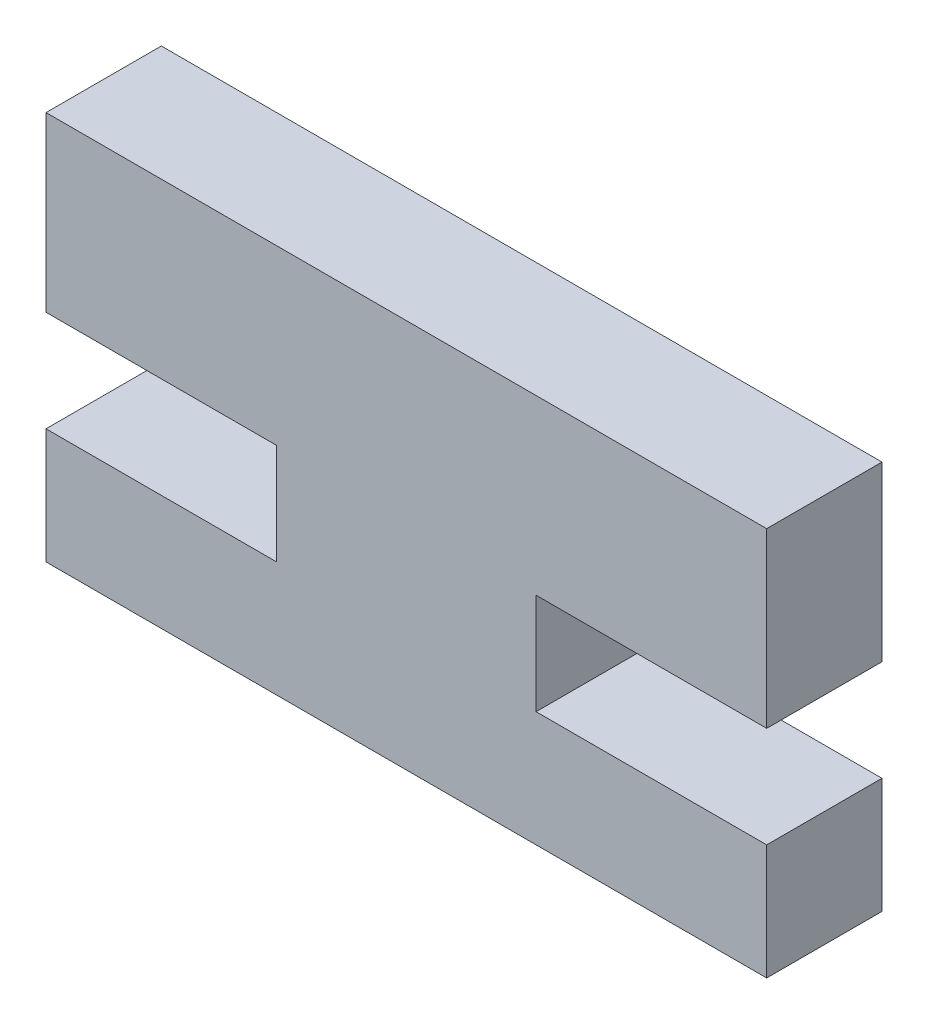
ISO-10303-21;
HEADER;
FILE_DESCRIPTION(('STEP AP214'),'2;1');
FILE_NAME('part.step','',(''),(''),'','','');
FILE_SCHEMA(('AUTOMOTIVE_DESIGN { 1 0 10303 214 1 1 1 1 }'));
ENDSEC;
DATA;
#1=APPLICATION_CONTEXT('core data for automotive mechanical design processes');
#2=APPLICATION_PROTOCOL_DEFINITION('international standard','automotive_design',2000,#1);
#3=PRODUCT_CONTEXT('',#1,'mechanical');
#4=PRODUCT('Part','Part','',(#3));
#5=PRODUCT_RELATED_PRODUCT_CATEGORY('part','',(#4));
#6=PRODUCT_DEFINITION_FORMATION('','',#4);
#7=PRODUCT_DEFINITION_CONTEXT('part definition',#1,'design');
#8=PRODUCT_DEFINITION('design','',#6,#7);
#9=PRODUCT_DEFINITION_SHAPE('','',#8);
#10=(LENGTH_UNIT() NAMED_UNIT(*) SI_UNIT(.MILLI.,.METRE.));
#11=(NAMED_UNIT(*) PLANE_ANGLE_UNIT() SI_UNIT($,.RADIAN.));
#12=(NAMED_UNIT(*) SI_UNIT($,.STERADIAN.) SOLID_ANGLE_UNIT());
#13=UNCERTAINTY_MEASURE_WITH_UNIT(LENGTH_MEASURE(1.E-05),#10,'distance_accuracy_value','');
#14=(GEOMETRIC_REPRESENTATION_CONTEXT(3) GLOBAL_UNCERTAINTY_ASSIGNED_CONTEXT((#13)) GLOBAL_UNIT_ASSIGNED_CONTEXT((#10,
#11,#12)) REPRESENTATION_CONTEXT('',''));
#15=CARTESIAN_POINT('',(0.,0.,0.));
#16=DIRECTION('',(0.,0.,1.));
#17=DIRECTION('',(1.,0.,0.));
#18=AXIS2_PLACEMENT_3D('',#15,#16,#17);
#19=CARTESIAN_POINT('',(-68.1719089808448,24.3044478848141,4.));
#20=DIRECTION('',(1.,0.,0.));
#21=DIRECTION('',(0.,0.,-1.));
#22=AXIS2_PLACEMENT_3D('',#19,#20,#21);
#23=PLANE('',#22);
#24=DIRECTION('',(0.,-1.,0.));
#25=VECTOR('',#24,1.);
#26=CARTESIAN_POINT('',(-68.1719089808448,24.3044478848141,0.));
#27=LINE('',#26,#25);
#28=CARTESIAN_POINT('',(-68.1719089808448,24.3044478848141,0.));
#29=VERTEX_POINT('',#28);
#30=CARTESIAN_POINT('',(-68.1719089808448,18.3044478848141,0.));
#31=VERTEX_POINT('',#30);
#32=EDGE_CURVE('E155',#29,#31,#27,.T.);
#33=ORIENTED_EDGE('',*,*,#32,.T.);
#34=DIRECTION('',(0.,0.,-1.));
#35=VECTOR('',#34,1.);
#36=CARTESIAN_POINT('',(-68.1719089808448,18.3044478848141,4.));
#37=LINE('',#36,#35);
#38=CARTESIAN_POINT('',(-68.1719089808448,18.3044478848141,4.));
#39=VERTEX_POINT('',#38);
#40=EDGE_CURVE('E11',#39,#31,#37,.T.);
#41=ORIENTED_EDGE('',*,*,#40,.F.);
#42=DIRECTION('',(0.,-1.,0.));
#43=VECTOR('',#42,1.);
#44=CARTESIAN_POINT('',(-68.1719089808448,24.3044478848141,4.));
#45=LINE('',#44,#43);
#46=CARTESIAN_POINT('',(-68.1719089808448,24.3044478848141,4.));
#47=VERTEX_POINT('',#46);
#48=EDGE_CURVE('E177',#47,#39,#45,.T.);
#49=ORIENTED_EDGE('',*,*,#48,.F.);
#50=DIRECTION('',(0.,0.,-1.));
#51=VECTOR('',#50,1.);
#52=CARTESIAN_POINT('',(-68.1719089808448,24.3044478848141,4.));
#53=LINE('',#52,#51);
#54=EDGE_CURVE('E151',#47,#29,#53,.T.);
#55=ORIENTED_EDGE('',*,*,#54,.T.);
#56=EDGE_LOOP('',(#33,#41,#49,#55));
#57=FACE_BOUND('',#56,.T.);
#58=ADVANCED_FACE('F35',(#57),#23,.F.);
#59=CARTESIAN_POINT('',(-68.1719089808448,18.3044478848141,4.));
#60=DIRECTION('',(0.,1.,0.));
#61=DIRECTION('',(0.,0.,1.));
#62=AXIS2_PLACEMENT_3D('',#59,#60,#61);
#63=PLANE('',#62);
#64=DIRECTION('',(1.,0.,0.));
#65=VECTOR('',#64,1.);
#66=CARTESIAN_POINT('',(-68.1719089808448,18.3044478848141,0.));
#67=LINE('',#66,#65);
#68=CARTESIAN_POINT('',(-60.1719089808448,18.3044478848141,0.));
#69=VERTEX_POINT('',#68);
#70=EDGE_CURVE('E158',#31,#69,#67,.T.);
#71=ORIENTED_EDGE('',*,*,#70,.T.);
#72=DIRECTION('',(0.,0.,-1.));
#73=VECTOR('',#72,1.);
#74=CARTESIAN_POINT('',(-60.1719089808448,18.3044478848141,4.));
#75=LINE('',#74,#73);
#76=CARTESIAN_POINT('',(-60.1719089808448,18.3044478848141,4.));
#77=VERTEX_POINT('',#76);
#78=EDGE_CURVE('E43',#77,#69,#75,.T.);
#79=ORIENTED_EDGE('',*,*,#78,.F.);
#80=DIRECTION('',(1.,0.,0.));
#81=VECTOR('',#80,1.);
#82=CARTESIAN_POINT('',(-68.1719089808448,18.3044478848141,4.));
#83=LINE('',#82,#81);
#84=EDGE_CURVE('E106',#39,#77,#83,.T.);
#85=ORIENTED_EDGE('',*,*,#84,.F.);
#86=ORIENTED_EDGE('',*,*,#40,.T.);
#87=EDGE_LOOP('',(#71,#79,#85,#86));
#88=FACE_BOUND('',#87,.T.);
#89=ADVANCED_FACE('F255',(#88),#63,.F.);
#90=CARTESIAN_POINT('',(-60.1719089808448,18.3044478848141,4.));
#91=DIRECTION('',(1.,0.,0.));
#92=DIRECTION('',(0.,1.,0.));
#93=AXIS2_PLACEMENT_3D('',#90,#91,#92);
#94=PLANE('',#93);
#95=DIRECTION('',(0.,-1.,0.));
#96=VECTOR('',#95,1.);
#97=CARTESIAN_POINT('',(-60.1719089808448,18.3044478848141,0.));
#98=LINE('',#97,#96);
#99=CARTESIAN_POINT('',(-60.1719089808448,14.8044478848141,0.));
#100=VERTEX_POINT('',#99);
#101=EDGE_CURVE('E160',#69,#100,#98,.T.);
#102=ORIENTED_EDGE('',*,*,#101,.T.);
#103=DIRECTION('',(0.,0.,-1.));
#104=VECTOR('',#103,1.);
#105=CARTESIAN_POINT('',(-60.1719089808448,14.8044478848141,4.));
#106=LINE('',#105,#104);
#107=CARTESIAN_POINT('',(-60.1719089808448,14.8044478848141,4.));
#108=VERTEX_POINT('',#107);
#109=EDGE_CURVE('E196',#108,#100,#106,.T.);
#110=ORIENTED_EDGE('',*,*,#109,.F.);
#111=DIRECTION('',(0.,-1.,0.));
#112=VECTOR('',#111,1.);
#113=CARTESIAN_POINT('',(-60.1719089808448,18.3044478848141,4.));
#114=LINE('',#113,#112);
#115=EDGE_CURVE('E204',#77,#108,#114,.T.);
#116=ORIENTED_EDGE('',*,*,#115,.F.);
#117=ORIENTED_EDGE('',*,*,#78,.T.);
#118=EDGE_LOOP('',(#102,#110,#116,#117));
#119=FACE_BOUND('',#118,.T.);
#120=ADVANCED_FACE('F202',(#119),#94,.F.);
#121=CARTESIAN_POINT('',(-68.1719089808448,14.8044478848141,4.));
#122=DIRECTION('',(0.,-1.,0.));
#123=DIRECTION('',(0.,0.,-1.));
#124=AXIS2_PLACEMENT_3D('',#121,#122,#123);
#125=PLANE('',#124);
#126=DIRECTION('',(-1.,0.,0.));
#127=VECTOR('',#126,1.);
#128=CARTESIAN_POINT('',(-68.1719089808448,14.8044478848141,0.));
#129=LINE('',#128,#127);
#130=CARTESIAN_POINT('',(-68.1719089808448,14.8044478848141,0.));
#131=VERTEX_POINT('',#130);
#132=EDGE_CURVE('E162',#100,#131,#129,.T.);
#133=ORIENTED_EDGE('',*,*,#132,.T.);
#134=DIRECTION('',(0.,0.,-1.));
#135=VECTOR('',#134,1.);
#136=CARTESIAN_POINT('',(-68.1719089808448,14.8044478848141,4.));
#137=LINE('',#136,#135);
#138=CARTESIAN_POINT('',(-68.1719089808448,14.8044478848141,4.));
#139=VERTEX_POINT('',#138);
#140=EDGE_CURVE('E193',#139,#131,#137,.T.);
#141=ORIENTED_EDGE('',*,*,#140,.F.);
#142=DIRECTION('',(-1.,0.,0.));
#143=VECTOR('',#142,1.);
#144=CARTESIAN_POINT('',(-68.1719089808448,14.8044478848141,4.));
#145=LINE('',#144,#143);
#146=EDGE_CURVE('E222',#108,#139,#145,.T.);
#147=ORIENTED_EDGE('',*,*,#146,.F.);
#148=ORIENTED_EDGE('',*,*,#109,.T.);
#149=EDGE_LOOP('',(#133,#141,#147,#148));
#150=FACE_BOUND('',#149,.T.);
#151=ADVANCED_FACE('F213',(#150),#125,.F.);
#152=CARTESIAN_POINT('',(-68.1719089808448,14.8044478848141,4.));
#153=DIRECTION('',(1.,0.,0.));
#154=DIRECTION('',(0.,0.,-1.));
#155=AXIS2_PLACEMENT_3D('',#152,#153,#154);
#156=PLANE('',#155);
#157=DIRECTION('',(0.,-1.,0.));
#158=VECTOR('',#157,1.);
#159=CARTESIAN_POINT('',(-68.1719089808448,14.8044478848141,0.));
#160=LINE('',#159,#158);
#161=CARTESIAN_POINT('',(-68.1719089808448,10.8044478848141,0.));
#162=VERTEX_POINT('',#161);
#163=EDGE_CURVE('E164',#131,#162,#160,.T.);
#164=ORIENTED_EDGE('',*,*,#163,.T.);
#165=DIRECTION('',(0.,0.,-1.));
#166=VECTOR('',#165,1.);
#167=CARTESIAN_POINT('',(-68.1719089808448,10.8044478848141,4.));
#168=LINE('',#167,#166);
#169=CARTESIAN_POINT('',(-68.1719089808448,10.8044478848141,4.));
#170=VERTEX_POINT('',#169);
#171=EDGE_CURVE('E190',#170,#162,#168,.T.);
#172=ORIENTED_EDGE('',*,*,#171,.F.);
#173=DIRECTION('',(0.,-1.,0.));
#174=VECTOR('',#173,1.);
#175=CARTESIAN_POINT('',(-68.1719089808448,14.8044478848141,4.));
#176=LINE('',#175,#174);
#177=EDGE_CURVE('E219',#139,#170,#176,.T.);
#178=ORIENTED_EDGE('',*,*,#177,.F.);
#179=ORIENTED_EDGE('',*,*,#140,.T.);
#180=EDGE_LOOP('',(#164,#172,#178,#179));
#181=FACE_BOUND('',#180,.T.);
#182=ADVANCED_FACE('F217',(#181),#156,.F.);
#183=CARTESIAN_POINT('',(-68.1719089808448,10.8044478848141,4.));
#184=DIRECTION('',(0.,1.,0.));
#185=DIRECTION('',(0.,0.,1.));
#186=AXIS2_PLACEMENT_3D('',#183,#184,#185);
#187=PLANE('',#186);
#188=DIRECTION('',(1.,0.,0.));
#189=VECTOR('',#188,1.);
#190=CARTESIAN_POINT('',(-68.1719089808448,10.8044478848141,0.));
#191=LINE('',#190,#189);
#192=CARTESIAN_POINT('',(-43.1719089808448,10.8044478848141,0.));
#193=VERTEX_POINT('',#192);
#194=EDGE_CURVE('E166',#162,#193,#191,.T.);
#195=ORIENTED_EDGE('',*,*,#194,.T.);
#196=DIRECTION('',(0.,0.,-1.));
#197=VECTOR('',#196,1.);
#198=CARTESIAN_POINT('',(-43.1719089808448,10.8044478848141,4.));
#199=LINE('',#198,#197);
#200=CARTESIAN_POINT('',(-43.1719089808448,10.8044478848141,4.));
#201=VERTEX_POINT('',#200);
#202=EDGE_CURVE('E187',#201,#193,#199,.T.);
#203=ORIENTED_EDGE('',*,*,#202,.F.);
#204=DIRECTION('',(1.,0.,0.));
#205=VECTOR('',#204,1.);
#206=CARTESIAN_POINT('',(-68.1719089808448,10.8044478848141,4.));
#207=LINE('',#206,#205);
#208=EDGE_CURVE('E221',#170,#201,#207,.T.);
#209=ORIENTED_EDGE('',*,*,#208,.F.);
#210=ORIENTED_EDGE('',*,*,#171,.T.);
#211=EDGE_LOOP('',(#195,#203,#209,#210));
#212=FACE_BOUND('',#211,.T.);
#213=ADVANCED_FACE('F268',(#212),#187,.F.);
#214=CARTESIAN_POINT('',(-43.1719089808448,14.8044478848141,4.));
#215=DIRECTION('',(-1.,0.,0.));
#216=DIRECTION('',(0.,0.,1.));
#217=AXIS2_PLACEMENT_3D('',#214,#215,#216);
#218=PLANE('',#217);
#219=DIRECTION('',(0.,1.,0.));
#220=VECTOR('',#219,1.);
#221=CARTESIAN_POINT('',(-43.1719089808448,14.8044478848141,0.));
#222=LINE('',#221,#220);
#223=CARTESIAN_POINT('',(-43.1719089808448,14.8044478848141,0.));
#224=VERTEX_POINT('',#223);
#225=EDGE_CURVE('E168',#193,#224,#222,.T.);
#226=ORIENTED_EDGE('',*,*,#225,.T.);
#227=DIRECTION('',(0.,0.,-1.));
#228=VECTOR('',#227,1.);
#229=CARTESIAN_POINT('',(-43.1719089808448,14.8044478848141,4.));
#230=LINE('',#229,#228);
#231=CARTESIAN_POINT('',(-43.1719089808448,14.8044478848141,4.));
#232=VERTEX_POINT('',#231);
#233=EDGE_CURVE('E184',#232,#224,#230,.T.);
#234=ORIENTED_EDGE('',*,*,#233,.F.);
#235=DIRECTION('',(0.,1.,0.));
#236=VECTOR('',#235,1.);
#237=CARTESIAN_POINT('',(-43.1719089808448,14.8044478848141,4.));
#238=LINE('',#237,#236);
#239=EDGE_CURVE('E224',#201,#232,#238,.T.);
#240=ORIENTED_EDGE('',*,*,#239,.F.);
#241=ORIENTED_EDGE('',*,*,#202,.T.);
#242=EDGE_LOOP('',(#226,#234,#240,#241));
#243=FACE_BOUND('',#242,.T.);
#244=ADVANCED_FACE('F271',(#243),#218,.F.);
#245=CARTESIAN_POINT('',(-51.1719089808448,14.8044478848141,4.));
#246=DIRECTION('',(0.,-1.,0.));
#247=DIRECTION('',(0.,0.,-1.));
#248=AXIS2_PLACEMENT_3D('',#245,#246,#247);
#249=PLANE('',#248);
#250=DIRECTION('',(-1.,0.,0.));
#251=VECTOR('',#250,1.);
#252=CARTESIAN_POINT('',(-51.1719089808448,14.8044478848141,0.));
#253=LINE('',#252,#251);
#254=CARTESIAN_POINT('',(-51.1719089808448,14.8044478848141,0.));
#255=VERTEX_POINT('',#254);
#256=EDGE_CURVE('E170',#224,#255,#253,.T.);
#257=ORIENTED_EDGE('',*,*,#256,.T.);
#258=DIRECTION('',(0.,0.,-1.));
#259=VECTOR('',#258,1.);
#260=CARTESIAN_POINT('',(-51.1719089808448,14.8044478848141,4.));
#261=LINE('',#260,#259);
#262=CARTESIAN_POINT('',(-51.1719089808448,14.8044478848141,4.));
#263=VERTEX_POINT('',#262);
#264=EDGE_CURVE('E181',#263,#255,#261,.T.);
#265=ORIENTED_EDGE('',*,*,#264,.F.);
#266=DIRECTION('',(-1.,0.,0.));
#267=VECTOR('',#266,1.);
#268=CARTESIAN_POINT('',(-51.1719089808448,14.8044478848141,4.));
#269=LINE('',#268,#267);
#270=EDGE_CURVE('E230',#232,#263,#269,.T.);
#271=ORIENTED_EDGE('',*,*,#270,.F.);
#272=ORIENTED_EDGE('',*,*,#233,.T.);
#273=EDGE_LOOP('',(#257,#265,#271,#272));
#274=FACE_BOUND('',#273,.T.);
#275=ADVANCED_FACE('F236',(#274),#249,.F.);
#276=CARTESIAN_POINT('',(-51.1719089808448,18.3044478848141,4.));
#277=DIRECTION('',(-1.,0.,0.));
#278=DIRECTION('',(0.,0.,1.));
#279=AXIS2_PLACEMENT_3D('',#276,#277,#278);
#280=PLANE('',#279);
#281=DIRECTION('',(0.,1.,0.));
#282=VECTOR('',#281,1.);
#283=CARTESIAN_POINT('',(-51.1719089808448,18.3044478848141,0.));
#284=LINE('',#283,#282);
#285=CARTESIAN_POINT('',(-51.1719089808448,18.3044478848141,0.));
#286=VERTEX_POINT('',#285);
#287=EDGE_CURVE('E172',#255,#286,#284,.T.);
#288=ORIENTED_EDGE('',*,*,#287,.T.);
#289=DIRECTION('',(0.,0.,-1.));
#290=VECTOR('',#289,1.);
#291=CARTESIAN_POINT('',(-51.1719089808448,18.3044478848141,4.));
#292=LINE('',#291,#290);
#293=CARTESIAN_POINT('',(-51.1719089808448,18.3044478848141,4.));
#294=VERTEX_POINT('',#293);
#295=EDGE_CURVE('E146',#294,#286,#292,.T.);
#296=ORIENTED_EDGE('',*,*,#295,.F.);
#297=DIRECTION('',(0.,1.,0.));
#298=VECTOR('',#297,1.);
#299=CARTESIAN_POINT('',(-51.1719089808448,18.3044478848141,4.));
#300=LINE('',#299,#298);
#301=EDGE_CURVE('E137',#263,#294,#300,.T.);
#302=ORIENTED_EDGE('',*,*,#301,.F.);
#303=ORIENTED_EDGE('',*,*,#264,.T.);
#304=EDGE_LOOP('',(#288,#296,#302,#303));
#305=FACE_BOUND('',#304,.T.);
#306=ADVANCED_FACE('F240',(#305),#280,.F.);
#307=CARTESIAN_POINT('',(-51.1719089808448,18.3044478848141,4.));
#308=DIRECTION('',(0.,1.,0.));
#309=DIRECTION('',(0.,0.,1.));
#310=AXIS2_PLACEMENT_3D('',#307,#308,#309);
#311=PLANE('',#310);
#312=DIRECTION('',(1.,0.,0.));
#313=VECTOR('',#312,1.);
#314=CARTESIAN_POINT('',(-51.1719089808448,18.3044478848141,0.));
#315=LINE('',#314,#313);
#316=CARTESIAN_POINT('',(-43.1719089808448,18.3044478848141,0.));
#317=VERTEX_POINT('',#316);
#318=EDGE_CURVE('E145',#286,#317,#315,.T.);
#319=ORIENTED_EDGE('',*,*,#318,.T.);
#320=DIRECTION('',(0.,0.,-1.));
#321=VECTOR('',#320,1.);
#322=CARTESIAN_POINT('',(-43.1719089808448,18.3044478848141,4.));
#323=LINE('',#322,#321);
#324=CARTESIAN_POINT('',(-43.1719089808448,18.3044478848141,4.));
#325=VERTEX_POINT('',#324);
#326=EDGE_CURVE('E142',#325,#317,#323,.T.);
#327=ORIENTED_EDGE('',*,*,#326,.F.);
#328=DIRECTION('',(1.,0.,0.));
#329=VECTOR('',#328,1.);
#330=CARTESIAN_POINT('',(-51.1719089808448,18.3044478848141,4.));
#331=LINE('',#330,#329);
#332=EDGE_CURVE('E131',#294,#325,#331,.T.);
#333=ORIENTED_EDGE('',*,*,#332,.F.);
#334=ORIENTED_EDGE('',*,*,#295,.T.);
#335=EDGE_LOOP('',(#319,#327,#333,#334));
#336=FACE_BOUND('',#335,.T.);
#337=ADVANCED_FACE('F143',(#336),#311,.F.);
#338=CARTESIAN_POINT('',(-43.1719089808448,18.3044478848141,4.));
#339=DIRECTION('',(-1.,0.,0.));
#340=DIRECTION('',(0.,0.,1.));
#341=AXIS2_PLACEMENT_3D('',#338,#339,#340);
#342=PLANE('',#341);
#343=DIRECTION('',(0.,1.,0.));
#344=VECTOR('',#343,1.);
#345=CARTESIAN_POINT('',(-43.1719089808448,18.3044478848141,0.));
#346=LINE('',#345,#344);
#347=CARTESIAN_POINT('',(-43.1719089808448,24.3044478848141,0.));
#348=VERTEX_POINT('',#347);
#349=EDGE_CURVE('E92',#317,#348,#346,.T.);
#350=ORIENTED_EDGE('',*,*,#349,.T.);
#351=DIRECTION('',(0.,0.,-1.));
#352=VECTOR('',#351,1.);
#353=CARTESIAN_POINT('',(-43.1719089808448,24.3044478848141,4.));
#354=LINE('',#353,#352);
#355=CARTESIAN_POINT('',(-43.1719089808448,24.3044478848141,4.));
#356=VERTEX_POINT('',#355);
#357=EDGE_CURVE('E147',#356,#348,#354,.T.);
#358=ORIENTED_EDGE('',*,*,#357,.F.);
#359=DIRECTION('',(0.,1.,0.));
#360=VECTOR('',#359,1.);
#361=CARTESIAN_POINT('',(-43.1719089808448,18.3044478848141,4.));
#362=LINE('',#361,#360);
#363=EDGE_CURVE('E135',#325,#356,#362,.T.);
#364=ORIENTED_EDGE('',*,*,#363,.F.);
#365=ORIENTED_EDGE('',*,*,#326,.T.);
#366=EDGE_LOOP('',(#350,#358,#364,#365));
#367=FACE_BOUND('',#366,.T.);
#368=ADVANCED_FACE('F149',(#367),#342,.F.);
#369=CARTESIAN_POINT('',(-68.1719089808448,24.3044478848141,4.));
#370=DIRECTION('',(0.,-1.,0.));
#371=DIRECTION('',(0.,0.,-1.));
#372=AXIS2_PLACEMENT_3D('',#369,#370,#371);
#373=PLANE('',#372);
#374=DIRECTION('',(-1.,0.,0.));
#375=VECTOR('',#374,1.);
#376=CARTESIAN_POINT('',(-68.1719089808448,24.3044478848141,0.));
#377=LINE('',#376,#375);
#378=EDGE_CURVE('E98',#348,#29,#377,.T.);
#379=ORIENTED_EDGE('',*,*,#378,.T.);
#380=ORIENTED_EDGE('',*,*,#54,.F.);
#381=DIRECTION('',(-1.,0.,0.));
#382=VECTOR('',#381,1.);
#383=CARTESIAN_POINT('',(-68.1719089808448,24.3044478848141,4.));
#384=LINE('',#383,#382);
#385=EDGE_CURVE('E51',#356,#47,#384,.T.);
#386=ORIENTED_EDGE('',*,*,#385,.F.);
#387=ORIENTED_EDGE('',*,*,#357,.T.);
#388=EDGE_LOOP('',(#379,#380,#386,#387));
#389=FACE_BOUND('',#388,.T.);
#390=ADVANCED_FACE('F244',(#389),#373,.F.);
#391=CARTESIAN_POINT('',(0.,0.,4.));
#392=DIRECTION('',(0.,0.,1.));
#393=DIRECTION('',(1.,0.,0.));
#394=AXIS2_PLACEMENT_3D('',#391,#392,#393);
#395=PLANE('',#394);
#396=ORIENTED_EDGE('',*,*,#48,.T.);
#397=ORIENTED_EDGE('',*,*,#84,.T.);
#398=ORIENTED_EDGE('',*,*,#115,.T.);
#399=ORIENTED_EDGE('',*,*,#146,.T.);
#400=ORIENTED_EDGE('',*,*,#177,.T.);
#401=ORIENTED_EDGE('',*,*,#208,.T.);
#402=ORIENTED_EDGE('',*,*,#239,.T.);
#403=ORIENTED_EDGE('',*,*,#270,.T.);
#404=ORIENTED_EDGE('',*,*,#301,.T.);
#405=ORIENTED_EDGE('',*,*,#332,.T.);
#406=ORIENTED_EDGE('',*,*,#363,.T.);
#407=ORIENTED_EDGE('',*,*,#385,.T.);
#408=EDGE_LOOP('',(#396,#397,#398,#399,#400,#401,#402,#403,#404,#405,#406,#407));
#409=FACE_BOUND('',#408,.T.);
#410=ADVANCED_FACE('F133',(#409),#395,.T.);
#411=CARTESIAN_POINT('',(0.,0.,0.));
#412=DIRECTION('',(0.,0.,1.));
#413=DIRECTION('',(1.,0.,0.));
#414=AXIS2_PLACEMENT_3D('',#411,#412,#413);
#415=PLANE('',#414);
#416=ORIENTED_EDGE('',*,*,#32,.F.);
#417=ORIENTED_EDGE('',*,*,#378,.F.);
#418=ORIENTED_EDGE('',*,*,#349,.F.);
#419=ORIENTED_EDGE('',*,*,#318,.F.);
#420=ORIENTED_EDGE('',*,*,#287,.F.);
#421=ORIENTED_EDGE('',*,*,#256,.F.);
#422=ORIENTED_EDGE('',*,*,#225,.F.);
#423=ORIENTED_EDGE('',*,*,#194,.F.);
#424=ORIENTED_EDGE('',*,*,#163,.F.);
#425=ORIENTED_EDGE('',*,*,#132,.F.);
#426=ORIENTED_EDGE('',*,*,#101,.F.);
#427=ORIENTED_EDGE('',*,*,#70,.F.);
#428=EDGE_LOOP('',(#416,#417,#418,#419,#420,#421,#422,#423,#424,#425,#426,#427));
#429=FACE_BOUND('',#428,.T.);
#430=ADVANCED_FACE('F208',(#429),#415,.F.);
#431=CLOSED_SHELL('',(#58,#89,#120,#151,#182,#213,#244,#275,#306,#337,#368,#390,#410,#430));
#432=MANIFOLD_SOLID_BREP('B2',#431);
#433=ADVANCED_BREP_SHAPE_REPRESENTATION('',(#18,#432),#14);
#434=SHAPE_DEFINITION_REPRESENTATION(#9,#433);
ENDSEC;
END-ISO-10303-21;
